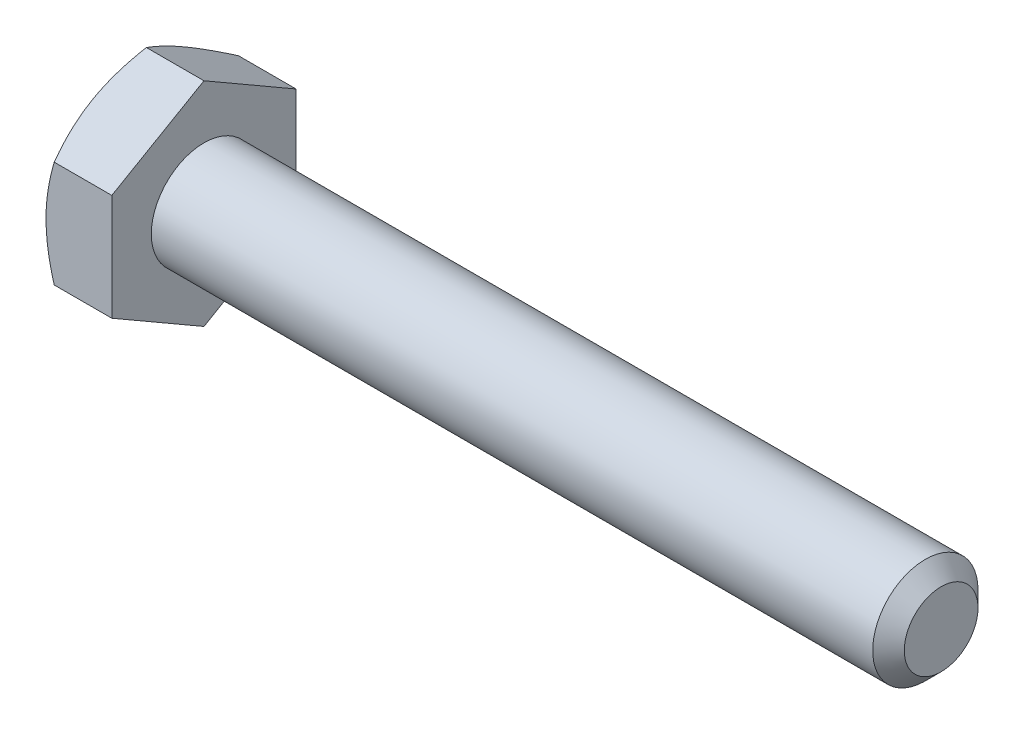
ISO-10303-21;
HEADER;
FILE_DESCRIPTION(('STEP AP214'),'2;1');
FILE_NAME('part.step','',(''),(''),'','','');
FILE_SCHEMA(('AUTOMOTIVE_DESIGN { 1 0 10303 214 1 1 1 1 }'));
ENDSEC;
DATA;
#1=APPLICATION_CONTEXT('core data for automotive mechanical design processes');
#2=APPLICATION_PROTOCOL_DEFINITION('international standard','automotive_design',2000,#1);
#3=PRODUCT_CONTEXT('',#1,'mechanical');
#4=PRODUCT('Part','Part','',(#3));
#5=PRODUCT_RELATED_PRODUCT_CATEGORY('part','',(#4));
#6=PRODUCT_DEFINITION_FORMATION('','',#4);
#7=PRODUCT_DEFINITION_CONTEXT('part definition',#1,'design');
#8=PRODUCT_DEFINITION('design','',#6,#7);
#9=PRODUCT_DEFINITION_SHAPE('','',#8);
#10=(LENGTH_UNIT() NAMED_UNIT(*) SI_UNIT(.MILLI.,.METRE.));
#11=(NAMED_UNIT(*) PLANE_ANGLE_UNIT() SI_UNIT($,.RADIAN.));
#12=(NAMED_UNIT(*) SI_UNIT($,.STERADIAN.) SOLID_ANGLE_UNIT());
#13=UNCERTAINTY_MEASURE_WITH_UNIT(LENGTH_MEASURE(1.E-05),#10,'distance_accuracy_value','');
#14=(GEOMETRIC_REPRESENTATION_CONTEXT(3) GLOBAL_UNCERTAINTY_ASSIGNED_CONTEXT((#13)) GLOBAL_UNIT_ASSIGNED_CONTEXT((#10,
#11,#12)) REPRESENTATION_CONTEXT('',''));
#15=CARTESIAN_POINT('',(0.,0.,0.));
#16=DIRECTION('',(0.,0.,1.));
#17=DIRECTION('',(1.,0.,0.));
#18=AXIS2_PLACEMENT_3D('',#15,#16,#17);
#19=CARTESIAN_POINT('',(-24.209375,-3.20790243318486,5.55625));
#20=DIRECTION('',(0.,0.,-1.));
#21=DIRECTION('',(0.,1.,0.));
#22=AXIS2_PLACEMENT_3D('',#19,#20,#21);
#23=PLANE('',#22);
#24=CARTESIAN_POINT('',(-21.4495843669925,-8.71597197874928,5.55625));
#25=CARTESIAN_POINT('',(-21.5681276134455,-8.47241296686081,5.55625));
#26=CARTESIAN_POINT('',(-21.6855624325106,-8.22830532002065,5.55625));
#27=CARTESIAN_POINT('',(-21.9175936359799,-7.73870131011008,5.55625));
#28=CARTESIAN_POINT('',(-22.0321895915108,-7.49320474401133,5.55625));
#29=CARTESIAN_POINT('',(-22.2584767997047,-6.99931388746861,5.55625));
#30=CARTESIAN_POINT('',(-22.3701496861504,-6.75091115377122,5.55625));
#31=CARTESIAN_POINT('',(-22.5890550680343,-6.25216399271396,5.55625));
#32=CARTESIAN_POINT('',(-22.6962877669676,-6.00181965496413,5.55625));
#33=CARTESIAN_POINT('',(-22.9086259632592,-5.49040404685734,5.55625));
#34=CARTESIAN_POINT('',(-23.0135413372932,-5.22925341692313,5.55625));
#35=CARTESIAN_POINT('',(-23.2156690406665,-4.70393363694384,5.55625));
#36=CARTESIAN_POINT('',(-23.3128805198239,-4.43976415741687,5.55625));
#37=CARTESIAN_POINT('',(-23.497121601985,-3.90845027150971,5.55625));
#38=CARTESIAN_POINT('',(-23.5841709710349,-3.64131278581567,5.55625));
#39=CARTESIAN_POINT('',(-23.7453596469694,-3.10320429735546,5.55625));
#40=CARTESIAN_POINT('',(-23.8195029151649,-2.83223449856134,5.55625));
#41=CARTESIAN_POINT('',(-23.9509992911479,-2.28781102521185,5.55625));
#42=CARTESIAN_POINT('',(-24.0084450300266,-2.01438008102813,5.55625));
#43=CARTESIAN_POINT('',(-24.1033467478451,-1.46397793148425,5.55625));
#44=CARTESIAN_POINT('',(-24.1408048504601,-1.18700710543778,5.55625));
#45=CARTESIAN_POINT('',(-24.179519215684,-0.77183967915967,5.55625));
#46=CARTESIAN_POINT('',(-24.189501938354,-0.634423748801413,5.55625));
#47=CARTESIAN_POINT('',(-24.2036468286742,-0.359297220791254,5.55625));
#48=CARTESIAN_POINT('',(-24.2078095453193,-0.221586652159766,5.55625));
#49=CARTESIAN_POINT('',(-24.2102100203321,0.0538978121001032,5.55625));
#50=CARTESIAN_POINT('',(-24.2084472582896,0.191671712228108,5.55625));
#51=CARTESIAN_POINT('',(-24.1990420123307,0.467008988572043,5.55625));
#52=CARTESIAN_POINT('',(-24.1913997515358,0.604572372578371,5.55625));
#53=CARTESIAN_POINT('',(-24.1663631708715,0.932168886546727,5.55625));
#54=CARTESIAN_POINT('',(-24.146346615147,1.12200607500774,5.55625));
#55=CARTESIAN_POINT('',(-24.0961855559147,1.50032750566802,5.55625));
#56=CARTESIAN_POINT('',(-24.0660397617237,1.68881157232281,5.55625));
#57=CARTESIAN_POINT('',(-23.9620024146897,2.25198169738515,5.55625));
#58=CARTESIAN_POINT('',(-23.8745274707725,2.6241947560597,5.55625));
#59=CARTESIAN_POINT('',(-23.7220938857469,3.18100797717286,5.55625));
#60=CARTESIAN_POINT('',(-23.666996347305,3.3684742193473,5.55625));
#61=CARTESIAN_POINT('',(-23.5508963006724,3.74158722888387,5.55625));
#62=CARTESIAN_POINT('',(-23.4898937479768,3.92723398252124,5.55625));
#63=CARTESIAN_POINT('',(-23.3629776325897,4.29676489564761,5.55625));
#64=CARTESIAN_POINT('',(-23.2970655075926,4.4806495534762,5.55625));
#65=CARTESIAN_POINT('',(-23.1611240596993,4.84688123577246,5.55625));
#66=CARTESIAN_POINT('',(-23.0910948245767,5.02922829292587,5.55625));
#67=CARTESIAN_POINT('',(-22.9001931773471,5.51260356628247,5.55625));
#68=CARTESIAN_POINT('',(-22.7763007551523,5.8124378410047,5.55625));
#69=CARTESIAN_POINT('',(-22.5214246065505,6.40908803513469,5.55625));
#70=CARTESIAN_POINT('',(-22.3904401468771,6.70590363865018,5.55625));
#71=CARTESIAN_POINT('',(-22.1230293545831,7.29719434259167,5.55625));
#72=CARTESIAN_POINT('',(-21.9866010743512,7.59166855933578,5.55624999999999));
#73=CARTESIAN_POINT('',(-21.7095811116465,8.17863206091545,5.55624999999999));
#74=CARTESIAN_POINT('',(-21.5689895864128,8.47112142020427,5.55624999999999));
#75=CARTESIAN_POINT('',(-21.284318147738,9.05495036819324,5.55624999999999));
#76=CARTESIAN_POINT('',(-21.1402332095448,9.34628750192602,5.55624999999999));
#77=CARTESIAN_POINT('',(-20.8494465475127,9.9276532853253,5.55624999999999));
#78=CARTESIAN_POINT('',(-20.7027448035253,10.2176819248953,5.55624999999999));
#79=CARTESIAN_POINT('',(-20.2595640177122,11.0860438246278,5.55624999999999));
#80=CARTESIAN_POINT('',(-19.9599489566421,11.6627758925917,5.55624999999999));
#81=CARTESIAN_POINT('',(-19.3862850053505,12.7539662387514,5.55624999999999));
#82=CARTESIAN_POINT('',(-19.1127850436465,13.2687144928819,5.55624999999999));
#83=CARTESIAN_POINT('',(-18.5624510158717,14.2964629870514,5.55624999999999));
#84=CARTESIAN_POINT('',(-18.2856167576174,14.8094631241242,5.55624999999999));
#85=CARTESIAN_POINT('',(-17.7303732577565,15.8324606524662,5.55624999999999));
#86=CARTESIAN_POINT('',(-17.4519720091832,16.3424623888781,5.55624999999999));
#87=CARTESIAN_POINT('',(-16.8932670469657,17.3613731639511,5.55624999999999));
#88=CARTESIAN_POINT('',(-16.6129634782856,17.8702822820683,5.55624999999999));
#89=CARTESIAN_POINT('',(-16.3319657879674,18.3788054223414,5.55624999999999));
#90=B_SPLINE_CURVE_WITH_KNOTS('',3,(#24,#25,#26,#27,#28,#29,#30,#31,#32,#33,#34,#35,#36,#37,#38,
#39,#40,#41,#42,#43,#44,#45,#46,#47,#48,#49,#50,#51,#52,#53,#54,#55,#56,#57,#58,#59,#60,#61,#62,
#63,#64,#65,#66,#67,#68,#69,#70,#71,#72,#73,#74,#75,#76,#77,#78,#79,#80,#81,#82,#83,#84,#85,#86,
#87,#88,#89),.UNSPECIFIED.,.F.,.F.,(4,2,2,2,2,2,2,2,2,2,2,2,2,2,2,2,2,2,2,2,2,2,2,2,2,2,2,2,2,2,
2,2,4),(0.,0.812635730373023,1.62539348788032,2.44240990684273,3.25938884015621,
4.10360649542401,4.94791718701091,5.79055726038603,6.63293824174536,7.47055271943839,
8.30807818332957,8.72130785168299,9.13449853788832,9.54772551385981,9.96093680902995,
10.5332843829937,11.1057049140379,12.2511183074305,12.8372525638741,13.4233912382427,
14.0093589404389,14.5953141547965,15.5684465267885,16.5416797066259,17.5152642537239,
18.4888120769129,19.4638547232904,20.4389048803864,22.3885945301673,24.1372706665326,
25.886048080782,27.6291677691576,29.3721560841402),.UNSPECIFIED.);
#91=CARTESIAN_POINT('',(-23.7131107665182,-3.20790243318486,5.55625));
#92=VERTEX_POINT('',#91);
#93=CARTESIAN_POINT('',(-24.209375,0.,5.55625));
#94=VERTEX_POINT('',#93);
#95=EDGE_CURVE('E280',#92,#94,#90,.T.);
#96=ORIENTED_EDGE('',*,*,#95,.F.);
#97=DIRECTION('',(1.,0.,0.));
#98=VECTOR('',#97,1.);
#99=CARTESIAN_POINT('',(-24.209375,-3.20790243318486,5.55625));
#100=LINE('',#99,#98);
#101=CARTESIAN_POINT('',(-20.240625,-3.20790243318486,5.55625));
#102=VERTEX_POINT('',#101);
#103=EDGE_CURVE('E283',#92,#102,#100,.T.);
#104=ORIENTED_EDGE('',*,*,#103,.T.);
#105=DIRECTION('',(0.,1.,0.));
#106=VECTOR('',#105,1.);
#107=CARTESIAN_POINT('',(-20.240625,-3.20790243318486,5.55625));
#108=LINE('',#107,#106);
#109=CARTESIAN_POINT('',(-20.240625,3.20790243318486,5.55625));
#110=VERTEX_POINT('',#109);
#111=EDGE_CURVE('E286',#102,#110,#108,.T.);
#112=ORIENTED_EDGE('',*,*,#111,.T.);
#113=DIRECTION('',(1.,0.,0.));
#114=VECTOR('',#113,1.);
#115=CARTESIAN_POINT('',(-24.209375,3.20790243318486,5.55625));
#116=LINE('',#115,#114);
#117=CARTESIAN_POINT('',(-23.7131107665182,3.20790243318486,5.55625));
#118=VERTEX_POINT('',#117);
#119=EDGE_CURVE('E242',#118,#110,#116,.T.);
#120=ORIENTED_EDGE('',*,*,#119,.F.);
#121=EDGE_CURVE('E119',#94,#118,#90,.T.);
#122=ORIENTED_EDGE('',*,*,#121,.F.);
#123=EDGE_LOOP('',(#96,#104,#112,#120,#122));
#124=FACE_BOUND('',#123,.T.);
#125=ADVANCED_FACE('F42',(#124),#23,.F.);
#126=CARTESIAN_POINT('',(-24.209375,3.20790243318486,5.55625));
#127=DIRECTION('',(0.,-0.866025403784438,-0.5));
#128=DIRECTION('',(0.,0.5,-0.866025403784439));
#129=AXIS2_PLACEMENT_3D('',#126,#127,#128);
#130=PLANE('',#129);
#131=CARTESIAN_POINT('',(-23.7130440980518,3.20778696313102,5.55645));
#132=CARTESIAN_POINT('',(-23.7537494396287,3.27830048099898,5.43431700443227));
#133=CARTESIAN_POINT('',(-23.7926074606368,3.34907690760433,5.31172863757364));
#134=CARTESIAN_POINT('',(-23.8661200665754,3.49120454378004,5.06555635055764));
#135=CARTESIAN_POINT('',(-23.9007728381981,3.56255598725623,4.94197202526351));
#136=CARTESIAN_POINT('',(-23.9977431144389,3.7777527611819,4.56924027919934));
#137=CARTESIAN_POINT('',(-24.052898945498,3.92244755263586,4.3186215488105));
#138=CARTESIAN_POINT('',(-24.117576095153,4.13898067940738,3.94357517172046));
#139=CARTESIAN_POINT('',(-24.1360008296374,4.21017202280888,3.82026814788997));
#140=CARTESIAN_POINT('',(-24.1668966337596,4.35287639627881,3.57309692257778));
#141=CARTESIAN_POINT('',(-24.179368229438,4.42438939736052,3.44923277130254));
#142=CARTESIAN_POINT('',(-24.1980399134017,4.56753961185542,3.20128932668298));
#143=CARTESIAN_POINT('',(-24.2042471193166,4.63917659144933,3.07721043832556));
#144=CARTESIAN_POINT('',(-24.2102635825862,4.7825127822332,2.82894487332451));
#145=CARTESIAN_POINT('',(-24.2100730375727,4.85421199143242,2.70475820012895));
#146=CARTESIAN_POINT('',(-24.2007567573071,5.05064720059277,2.36452243746779));
#147=CARTESIAN_POINT('',(-24.1851153403106,5.1753189069971,2.14858470770919));
#148=CARTESIAN_POINT('',(-24.1355150950254,5.42383425573453,1.71814349723526));
#149=CARTESIAN_POINT('',(-24.1015393117333,5.54767702400135,1.50364153044716));
#150=CARTESIAN_POINT('',(-24.0166092499519,5.79669255822861,1.07233397329164));
#151=CARTESIAN_POINT('',(-23.9652951119579,5.92183390122649,0.855582809091896));
#152=CARTESIAN_POINT('',(-23.8488325447076,6.17025031750736,0.425312954659246));
#153=CARTESIAN_POINT('',(-23.7837114741206,6.29352857247572,0.211788753585619));
#154=CARTESIAN_POINT('',(-23.7130440980518,6.41592033642355,-0.000200000000001761));
#155=B_SPLINE_CURVE_WITH_KNOTS('',3,(#131,#132,#133,#134,#135,#136,#137,#138,#139,#140,#141,
#142,#143,#144,#145,#146,#147,#148,#149,#150,#151,#152,#153,#154),.UNSPECIFIED.,.F.,.F.,(4,2,2,
2,2,2,2,2,2,2,2,4),(0.,0.440316908268041,0.880823012040823,1.76366572331169,2.19427472390783,
2.62484566732156,3.05492684132792,3.48499472977669,4.23370964386674,4.98311813377593,
5.74914806559356,6.51367405016872),.UNSPECIFIED.);
#156=CARTESIAN_POINT('',(-24.209375,4.81185364977729,2.778125));
#157=VERTEX_POINT('',#156);
#158=EDGE_CURVE('E115',#118,#157,#155,.T.);
#159=ORIENTED_EDGE('',*,*,#158,.F.);
#160=ORIENTED_EDGE('',*,*,#119,.T.);
#161=DIRECTION('',(0.,0.5,-0.866025403784438));
#162=VECTOR('',#161,1.);
#163=CARTESIAN_POINT('',(-20.240625,3.20790243318486,5.55625));
#164=LINE('',#163,#162);
#165=CARTESIAN_POINT('',(-20.240625,6.41580486636972,0.));
#166=VERTEX_POINT('',#165);
#167=EDGE_CURVE('E310',#110,#166,#164,.T.);
#168=ORIENTED_EDGE('',*,*,#167,.T.);
#169=DIRECTION('',(1.,0.,0.));
#170=VECTOR('',#169,1.);
#171=CARTESIAN_POINT('',(-24.209375,6.41580486636972,0.));
#172=LINE('',#171,#170);
#173=CARTESIAN_POINT('',(-23.7131107665182,6.41580486636972,0.));
#174=VERTEX_POINT('',#173);
#175=EDGE_CURVE('E140',#174,#166,#172,.T.);
#176=ORIENTED_EDGE('',*,*,#175,.F.);
#177=EDGE_CURVE('E124',#157,#174,#155,.T.);
#178=ORIENTED_EDGE('',*,*,#177,.F.);
#179=EDGE_LOOP('',(#159,#160,#168,#176,#178));
#180=FACE_BOUND('',#179,.T.);
#181=ADVANCED_FACE('F138',(#180),#130,.F.);
#182=CARTESIAN_POINT('',(-24.209375,6.41580486636972,0.));
#183=DIRECTION('',(0.,-0.866025403784439,0.5));
#184=DIRECTION('',(0.,-0.5,-0.866025403784439));
#185=AXIS2_PLACEMENT_3D('',#182,#183,#184);
#186=PLANE('',#185);
#187=CARTESIAN_POINT('',(-23.7130440980518,6.41592033642355,0.000199999999998725));
#188=CARTESIAN_POINT('',(-23.7537494396287,6.34540681855559,-0.121932995567732));
#189=CARTESIAN_POINT('',(-23.7926074606368,6.27463039195025,-0.244521362426355));
#190=CARTESIAN_POINT('',(-23.8661200665754,6.13250275577453,-0.490693649442358));
#191=CARTESIAN_POINT('',(-23.9007728381981,6.06115131229835,-0.61427797473649));
#192=CARTESIAN_POINT('',(-23.9977431144389,5.84595453837268,-0.987009720800664));
#193=CARTESIAN_POINT('',(-24.052898945498,5.70125974691872,-1.2376284511895));
#194=CARTESIAN_POINT('',(-24.117576095153,5.48472662014719,-1.61267482827954));
#195=CARTESIAN_POINT('',(-24.1360008296374,5.41353527674569,-1.73598185211002));
#196=CARTESIAN_POINT('',(-24.1668966337596,5.27083090327577,-1.98315307742222));
#197=CARTESIAN_POINT('',(-24.179368229438,5.19931790219406,-2.10701722869746));
#198=CARTESIAN_POINT('',(-24.1980399134017,5.05616768769916,-2.35496067331702));
#199=CARTESIAN_POINT('',(-24.2042471193166,4.98453070810525,-2.47903956167444));
#200=CARTESIAN_POINT('',(-24.2102635825862,4.84119451732138,-2.72730512667549));
#201=CARTESIAN_POINT('',(-24.2100730375727,4.76949530812216,-2.85149179987105));
#202=CARTESIAN_POINT('',(-24.2007567573071,4.5730600989618,-3.19172756253221));
#203=CARTESIAN_POINT('',(-24.1851153403106,4.44838839255747,-3.40766529229081));
#204=CARTESIAN_POINT('',(-24.1355150950254,4.19987304382004,-3.83810650276474));
#205=CARTESIAN_POINT('',(-24.1015393117333,4.07603027555323,-4.05260846955284));
#206=CARTESIAN_POINT('',(-24.0166092499519,3.82701474132597,-4.48391602670836));
#207=CARTESIAN_POINT('',(-23.9652951119579,3.70187339832808,-4.7006671909081));
#208=CARTESIAN_POINT('',(-23.8488325447076,3.45345698204721,-5.13093704534075));
#209=CARTESIAN_POINT('',(-23.7837114741206,3.33017872707885,-5.34446124641438));
#210=CARTESIAN_POINT('',(-23.7130440980518,3.20778696313102,-5.55645));
#211=B_SPLINE_CURVE_WITH_KNOTS('',3,(#187,#188,#189,#190,#191,#192,#193,#194,#195,#196,#197,
#198,#199,#200,#201,#202,#203,#204,#205,#206,#207,#208,#209,#210),.UNSPECIFIED.,.F.,.F.,(4,2,2,
2,2,2,2,2,2,2,2,4),(0.,0.440316908268042,0.880823012040824,1.76366572331169,2.19427472390783,
2.62484566732156,3.05492684132792,3.48499472977669,4.23370964386674,4.98311813377593,
5.74914806559356,6.51367405016872),.UNSPECIFIED.);
#212=CARTESIAN_POINT('',(-24.209375,4.81185364977729,-2.778125));
#213=VERTEX_POINT('',#212);
#214=EDGE_CURVE('E129',#174,#213,#211,.T.);
#215=ORIENTED_EDGE('',*,*,#214,.F.);
#216=ORIENTED_EDGE('',*,*,#175,.T.);
#217=DIRECTION('',(0.,-0.5,-0.866025403784439));
#218=VECTOR('',#217,1.);
#219=CARTESIAN_POINT('',(-20.240625,6.41580486636972,0.));
#220=LINE('',#219,#218);
#221=CARTESIAN_POINT('',(-20.240625,3.20790243318486,-5.55625));
#222=VERTEX_POINT('',#221);
#223=EDGE_CURVE('E307',#166,#222,#220,.T.);
#224=ORIENTED_EDGE('',*,*,#223,.T.);
#225=DIRECTION('',(1.,0.,0.));
#226=VECTOR('',#225,1.);
#227=CARTESIAN_POINT('',(-24.209375,3.20790243318486,-5.55625));
#228=LINE('',#227,#226);
#229=CARTESIAN_POINT('',(-23.7131107665182,3.20790243318486,-5.55625));
#230=VERTEX_POINT('',#229);
#231=EDGE_CURVE('E302',#230,#222,#228,.T.);
#232=ORIENTED_EDGE('',*,*,#231,.F.);
#233=EDGE_CURVE('E143',#213,#230,#211,.T.);
#234=ORIENTED_EDGE('',*,*,#233,.F.);
#235=EDGE_LOOP('',(#215,#216,#224,#232,#234));
#236=FACE_BOUND('',#235,.T.);
#237=ADVANCED_FACE('F204',(#236),#186,.F.);
#238=CARTESIAN_POINT('',(-24.209375,3.20790243318486,-5.55625));
#239=DIRECTION('',(0.,0.,1.));
#240=DIRECTION('',(0.,-1.,0.));
#241=AXIS2_PLACEMENT_3D('',#238,#239,#240);
#242=PLANE('',#241);
#243=CARTESIAN_POINT('',(-21.449584368384,-8.71597197589097,-5.55625));
#244=CARTESIAN_POINT('',(-21.568127614779,-8.4724129640987,-5.55625));
#245=CARTESIAN_POINT('',(-21.685562433786,-8.22830531735482,-5.55625));
#246=CARTESIAN_POINT('',(-21.9175936371396,-7.73870130763708,-5.55625));
#247=CARTESIAN_POINT('',(-22.0321895926128,-7.4932047416349,-5.55625));
#248=CARTESIAN_POINT('',(-22.2584768006911,-6.99931388528678,-5.55625));
#249=CARTESIAN_POINT('',(-22.3701496870791,-6.75091115168743,-5.55625));
#250=CARTESIAN_POINT('',(-22.5890550688484,-6.25216399082691,-5.55625));
#251=CARTESIAN_POINT('',(-22.6962877677249,-6.00181965317578,-5.55625));
#252=CARTESIAN_POINT('',(-22.9086259639013,-5.49040404527406,-5.55625));
#253=CARTESIAN_POINT('',(-23.013541337877,-5.22925341544629,-5.55625));
#254=CARTESIAN_POINT('',(-23.2156690411367,-4.70393363568156,-5.55625));
#255=CARTESIAN_POINT('',(-23.3128805202389,-4.43976415626273,-5.55625));
#256=CARTESIAN_POINT('',(-23.4971216022948,-3.90845027057386,-5.55625));
#257=CARTESIAN_POINT('',(-23.5841709712948,-3.64131278498994,-5.55625));
#258=CARTESIAN_POINT('',(-23.7453596471374,-3.10320429675299,-5.55625));
#259=CARTESIAN_POINT('',(-23.819502915291,-2.83223449807201,-5.55625));
#260=CARTESIAN_POINT('',(-23.9509992911896,-2.28781102500664,-5.55625));
#261=CARTESIAN_POINT('',(-24.0084450300289,-2.01438008099472,-5.55625));
#262=CARTESIAN_POINT('',(-24.1033467477944,-1.46397793179866,-5.55625));
#263=CARTESIAN_POINT('',(-24.1408048503959,-1.18700710592821,-5.55625));
#264=CARTESIAN_POINT('',(-24.1795192156229,-0.771839679912929,-5.55625));
#265=CARTESIAN_POINT('',(-24.1895019382978,-0.634423749641011,-5.55625));
#266=CARTESIAN_POINT('',(-24.2036468286352,-0.359297221803361,-5.55625));
#267=CARTESIAN_POINT('',(-24.2078095452928,-0.221586653258043,-5.55625));
#268=CARTESIAN_POINT('',(-24.2102100203379,0.0538978108301058,-5.55625));
#269=CARTESIAN_POINT('',(-24.2084472583154,0.191671710872559,-5.55625));
#270=CARTESIAN_POINT('',(-24.1990420124033,0.467008987046523,-5.55625));
#271=CARTESIAN_POINT('',(-24.1913997516352,0.604572370968431,-5.55625));
#272=CARTESIAN_POINT('',(-24.1663631710371,0.932168884806747,-5.55625));
#273=CARTESIAN_POINT('',(-24.1463466153506,1.12200607322251,-5.55625));
#274=CARTESIAN_POINT('',(-24.0961855561963,1.50032750379435,-5.55625));
#275=CARTESIAN_POINT('',(-24.0660397620454,1.68881157040595,-5.55625));
#276=CARTESIAN_POINT('',(-23.9620024151322,2.25198169534108,-5.55625));
#277=CARTESIAN_POINT('',(-23.8745274712967,2.62419475393417,-5.55625));
#278=CARTESIAN_POINT('',(-23.7220938863917,3.18100797492548,-5.55625));
#279=CARTESIAN_POINT('',(-23.6669963479902,3.36847421705843,-5.55625));
#280=CARTESIAN_POINT('',(-23.5508963014373,3.74158722651249,-5.55625));
#281=CARTESIAN_POINT('',(-23.4898937487809,3.92723398010884,-5.55625));
#282=CARTESIAN_POINT('',(-23.3629776334707,4.29676489315347,-5.55625));
#283=CARTESIAN_POINT('',(-23.2970655085115,4.48064955094134,-5.55625));
#284=CARTESIAN_POINT('',(-23.1611240606925,4.84688123315617,-5.55625));
#285=CARTESIAN_POINT('',(-23.0910948256063,5.02922829026885,-5.55625));
#286=CARTESIAN_POINT('',(-22.9001931784386,5.51260356360176,-5.55625));
#287=CARTESIAN_POINT('',(-22.7763007562656,5.81243783833987,-5.55625));
#288=CARTESIAN_POINT('',(-22.5214246077012,6.4090880324996,-5.55625));
#289=CARTESIAN_POINT('',(-22.3904401480433,6.70590363602894,-5.55625));
#290=CARTESIAN_POINT('',(-22.1230293557759,7.29719433999666,-5.55625));
#291=CARTESIAN_POINT('',(-21.9866010755551,7.59166855675315,-5.55625));
#292=CARTESIAN_POINT('',(-21.7095811128693,8.17863205835625,-5.55625));
#293=CARTESIAN_POINT('',(-21.5689895876434,8.47112141765612,-5.55625));
#294=CARTESIAN_POINT('',(-21.2843181489817,9.05495036566683,-5.55625));
#295=CARTESIAN_POINT('',(-21.1402332107937,9.34628749941031,-5.55625));
#296=CARTESIAN_POINT('',(-20.8494465487701,9.92765328283016,-5.55625));
#297=CARTESIAN_POINT('',(-20.7027448047861,10.2176819224101,-5.55625));
#298=CARTESIAN_POINT('',(-20.2595640189813,11.086043822171,-5.55625));
#299=CARTESIAN_POINT('',(-19.9599489579141,11.6627758901527,-5.55625));
#300=CARTESIAN_POINT('',(-19.3862850066326,12.75396623633,-5.55625));
#301=CARTESIAN_POINT('',(-19.1127850449362,13.2687144904607,-5.55625));
#302=CARTESIAN_POINT('',(-18.5624510171751,14.2964629846299,-5.55625));
#303=CARTESIAN_POINT('',(-18.2856167589269,14.8094631217022,-5.55625));
#304=CARTESIAN_POINT('',(-17.7303732590784,15.8324606500401,-5.55625));
#305=CARTESIAN_POINT('',(-17.4519720105114,16.3424623864486,-5.55625));
#306=CARTESIAN_POINT('',(-16.8932670483059,17.3613731615141,-5.55625));
#307=CARTESIAN_POINT('',(-16.6129634796314,17.8702822796274,-5.55625));
#308=CARTESIAN_POINT('',(-16.3319657893186,18.3788054198964,-5.55625));
#309=B_SPLINE_CURVE_WITH_KNOTS('',3,(#243,#244,#245,#246,#247,#248,#249,#250,#251,#252,#253,
#254,#255,#256,#257,#258,#259,#260,#261,#262,#263,#264,#265,#266,#267,#268,#269,#270,#271,#272,
#273,#274,#275,#276,#277,#278,#279,#280,#281,#282,#283,#284,#285,#286,#287,#288,#289,#290,#291,
#292,#293,#294,#295,#296,#297,#298,#299,#300,#301,#302,#303,#304,#305,#306,#307,#308),
.UNSPECIFIED.,.F.,.F.,(4,2,2,2,2,2,2,2,2,2,2,2,2,2,2,2,2,2,2,2,2,2,2,2,2,2,2,2,2,2,2,2,4),(0.,
0.812635730037296,1.62539348720883,2.44240990583192,3.25938883880611,4.10360649371243,
4.94791718493774,5.79055725795246,6.63293823895167,7.4705527161171,8.30807817948146,
8.7213078475778,9.13449853352613,9.54772550924045,9.96093680415345,10.5332843779703,
11.1057049088676,12.2511183019659,12.8372525582557,13.4233912324707,14.0093589345136,
14.5953141487179,15.5684465207287,16.5416797005853,17.5152642477029,18.4888120709116,
19.4638547173109,20.4389048744288,22.3885945242527,24.1372706606078,25.8860480748471,
27.6291677632044,29.3721560781684),.UNSPECIFIED.);
#310=CARTESIAN_POINT('',(-24.209375,0.,-5.55625));
#311=VERTEX_POINT('',#310);
#312=EDGE_CURVE('E198',#230,#311,#309,.F.);
#313=ORIENTED_EDGE('',*,*,#312,.F.);
#314=ORIENTED_EDGE('',*,*,#231,.T.);
#315=DIRECTION('',(0.,-1.,0.));
#316=VECTOR('',#315,1.);
#317=CARTESIAN_POINT('',(-20.240625,3.20790243318486,-5.55625));
#318=LINE('',#317,#316);
#319=CARTESIAN_POINT('',(-20.240625,-3.20790243318486,-5.55625));
#320=VERTEX_POINT('',#319);
#321=EDGE_CURVE('E315',#222,#320,#318,.T.);
#322=ORIENTED_EDGE('',*,*,#321,.T.);
#323=DIRECTION('',(1.,0.,0.));
#324=VECTOR('',#323,1.);
#325=CARTESIAN_POINT('',(-24.209375,-3.20790243318486,-5.55625));
#326=LINE('',#325,#324);
#327=CARTESIAN_POINT('',(-23.7131107665182,-3.20790243318486,-5.55625));
#328=VERTEX_POINT('',#327);
#329=EDGE_CURVE('E264',#328,#320,#326,.T.);
#330=ORIENTED_EDGE('',*,*,#329,.F.);
#331=EDGE_CURVE('E191',#311,#328,#309,.F.);
#332=ORIENTED_EDGE('',*,*,#331,.F.);
#333=EDGE_LOOP('',(#313,#314,#322,#330,#332));
#334=FACE_BOUND('',#333,.T.);
#335=ADVANCED_FACE('F200',(#334),#242,.F.);
#336=CARTESIAN_POINT('',(-24.209375,-3.20790243318486,-5.55625));
#337=DIRECTION('',(0.,0.866025403784439,0.5));
#338=DIRECTION('',(0.,-0.5,0.866025403784439));
#339=AXIS2_PLACEMENT_3D('',#336,#337,#338);
#340=PLANE('',#339);
#341=CARTESIAN_POINT('',(-23.7130440980518,-3.20778696313102,-5.55645));
#342=CARTESIAN_POINT('',(-23.7537494396287,-3.27830048099898,-5.43431700443227));
#343=CARTESIAN_POINT('',(-23.7926074606368,-3.34907690760433,-5.31172863757365));
#344=CARTESIAN_POINT('',(-23.8661200665754,-3.49120454378004,-5.06555635055764));
#345=CARTESIAN_POINT('',(-23.9007728381981,-3.56255598725623,-4.94197202526351));
#346=CARTESIAN_POINT('',(-23.9977431144389,-3.7777527611819,-4.56924027919934));
#347=CARTESIAN_POINT('',(-24.052898945498,-3.92244755263586,-4.3186215488105));
#348=CARTESIAN_POINT('',(-24.117576095153,-4.13898067940738,-3.94357517172046));
#349=CARTESIAN_POINT('',(-24.1360008296374,-4.21017202280888,-3.82026814788997));
#350=CARTESIAN_POINT('',(-24.1668966337596,-4.35287639627881,-3.57309692257778));
#351=CARTESIAN_POINT('',(-24.179368229438,-4.42438939736051,-3.44923277130254));
#352=CARTESIAN_POINT('',(-24.1980399134017,-4.56753961185542,-3.20128932668298));
#353=CARTESIAN_POINT('',(-24.2042471193166,-4.63917659144933,-3.07721043832556));
#354=CARTESIAN_POINT('',(-24.2102635825862,-4.7825127822332,-2.82894487332451));
#355=CARTESIAN_POINT('',(-24.2100730375727,-4.85421199143242,-2.70475820012895));
#356=CARTESIAN_POINT('',(-24.2007567573071,-5.05064720059277,-2.36452243746779));
#357=CARTESIAN_POINT('',(-24.1851153403106,-5.1753189069971,-2.14858470770919));
#358=CARTESIAN_POINT('',(-24.1355150950254,-5.42383425573453,-1.71814349723526));
#359=CARTESIAN_POINT('',(-24.1015393117333,-5.54767702400135,-1.50364153044716));
#360=CARTESIAN_POINT('',(-24.0166092499519,-5.7966925582286,-1.07233397329164));
#361=CARTESIAN_POINT('',(-23.9652951119579,-5.92183390122649,-0.855582809091897));
#362=CARTESIAN_POINT('',(-23.8488325447076,-6.17025031750736,-0.425312954659246));
#363=CARTESIAN_POINT('',(-23.7837114741206,-6.29352857247572,-0.21178875358562));
#364=CARTESIAN_POINT('',(-23.7130440980518,-6.41592033642355,0.000200000000000885));
#365=B_SPLINE_CURVE_WITH_KNOTS('',3,(#341,#342,#343,#344,#345,#346,#347,#348,#349,#350,#351,
#352,#353,#354,#355,#356,#357,#358,#359,#360,#361,#362,#363,#364),.UNSPECIFIED.,.F.,.F.,(4,2,2,
2,2,2,2,2,2,2,2,4),(0.,0.440316908268041,0.880823012040824,1.76366572331169,2.19427472390783,
2.62484566732156,3.05492684132792,3.48499472977669,4.23370964386674,4.98311813377593,
5.74914806559356,6.51367405016872),.UNSPECIFIED.);
#366=CARTESIAN_POINT('',(-24.209375,-4.81185364977729,-2.778125));
#367=VERTEX_POINT('',#366);
#368=EDGE_CURVE('E199',#328,#367,#365,.T.);
#369=ORIENTED_EDGE('',*,*,#368,.F.);
#370=ORIENTED_EDGE('',*,*,#329,.T.);
#371=DIRECTION('',(0.,-0.5,0.866025403784439));
#372=VECTOR('',#371,1.);
#373=CARTESIAN_POINT('',(-20.240625,-3.20790243318486,-5.55625));
#374=LINE('',#373,#372);
#375=CARTESIAN_POINT('',(-20.240625,-6.41580486636971,0.));
#376=VERTEX_POINT('',#375);
#377=EDGE_CURVE('E296',#320,#376,#374,.T.);
#378=ORIENTED_EDGE('',*,*,#377,.T.);
#379=DIRECTION('',(1.,0.,0.));
#380=VECTOR('',#379,1.);
#381=CARTESIAN_POINT('',(-24.209375,-6.41580486636971,0.));
#382=LINE('',#381,#380);
#383=CARTESIAN_POINT('',(-23.7131107665182,-6.41580486636971,0.));
#384=VERTEX_POINT('',#383);
#385=EDGE_CURVE('E291',#384,#376,#382,.T.);
#386=ORIENTED_EDGE('',*,*,#385,.F.);
#387=EDGE_CURVE('E185',#367,#384,#365,.T.);
#388=ORIENTED_EDGE('',*,*,#387,.F.);
#389=EDGE_LOOP('',(#369,#370,#378,#386,#388));
#390=FACE_BOUND('',#389,.T.);
#391=ADVANCED_FACE('F203',(#390),#340,.F.);
#392=CARTESIAN_POINT('',(-24.209375,-6.41580486636971,0.));
#393=DIRECTION('',(0.,0.866025403784439,-0.5));
#394=DIRECTION('',(0.,0.5,0.866025403784439));
#395=AXIS2_PLACEMENT_3D('',#392,#393,#394);
#396=PLANE('',#395);
#397=CARTESIAN_POINT('',(-23.7130440980518,-6.41592033642355,-0.000199999999998803));
#398=CARTESIAN_POINT('',(-23.7537494396287,-6.34540681855559,0.121932995567732));
#399=CARTESIAN_POINT('',(-23.7926074606368,-6.27463039195025,0.244521362426354));
#400=CARTESIAN_POINT('',(-23.8661200665754,-6.13250275577453,0.490693649442357));
#401=CARTESIAN_POINT('',(-23.9007728381981,-6.06115131229835,0.614277974736488));
#402=CARTESIAN_POINT('',(-23.9977431144389,-5.84595453837268,0.987009720800663));
#403=CARTESIAN_POINT('',(-24.052898945498,-5.70125974691872,1.2376284511895));
#404=CARTESIAN_POINT('',(-24.117576095153,-5.48472662014719,1.61267482827954));
#405=CARTESIAN_POINT('',(-24.1360008296374,-5.41353527674569,1.73598185211002));
#406=CARTESIAN_POINT('',(-24.1668966337596,-5.27083090327577,1.98315307742222));
#407=CARTESIAN_POINT('',(-24.179368229438,-5.19931790219406,2.10701722869746));
#408=CARTESIAN_POINT('',(-24.1980399134017,-5.05616768769915,2.35496067331702));
#409=CARTESIAN_POINT('',(-24.2042471193166,-4.98453070810525,2.47903956167444));
#410=CARTESIAN_POINT('',(-24.2102635825862,-4.84119451732138,2.72730512667549));
#411=CARTESIAN_POINT('',(-24.2100730375727,-4.76949530812216,2.85149179987105));
#412=CARTESIAN_POINT('',(-24.2007567573071,-4.5730600989618,3.19172756253221));
#413=CARTESIAN_POINT('',(-24.1851153403106,-4.44838839255747,3.40766529229081));
#414=CARTESIAN_POINT('',(-24.1355150950254,-4.19987304382004,3.83810650276474));
#415=CARTESIAN_POINT('',(-24.1015393117333,-4.07603027555323,4.05260846955284));
#416=CARTESIAN_POINT('',(-24.0166092499519,-3.82701474132597,4.48391602670836));
#417=CARTESIAN_POINT('',(-23.9652951119579,-3.70187339832808,4.7006671909081));
#418=CARTESIAN_POINT('',(-23.8488325447076,-3.45345698204721,5.13093704534075));
#419=CARTESIAN_POINT('',(-23.7837114741206,-3.33017872707885,5.34446124641438));
#420=CARTESIAN_POINT('',(-23.7130440980518,-3.20778696313102,5.55645));
#421=B_SPLINE_CURVE_WITH_KNOTS('',3,(#397,#398,#399,#400,#401,#402,#403,#404,#405,#406,#407,
#408,#409,#410,#411,#412,#413,#414,#415,#416,#417,#418,#419,#420),.UNSPECIFIED.,.F.,.F.,(4,2,2,
2,2,2,2,2,2,2,2,4),(0.,0.440316908268041,0.880823012040822,1.76366572331169,2.19427472390783,
2.62484566732156,3.05492684132792,3.48499472977669,4.23370964386674,4.98311813377593,
5.74914806559356,6.51367405016872),.UNSPECIFIED.);
#422=CARTESIAN_POINT('',(-24.209375,-4.81185364977729,2.778125));
#423=VERTEX_POINT('',#422);
#424=EDGE_CURVE('E273',#384,#423,#421,.T.);
#425=ORIENTED_EDGE('',*,*,#424,.F.);
#426=ORIENTED_EDGE('',*,*,#385,.T.);
#427=DIRECTION('',(0.,0.5,0.866025403784439));
#428=VECTOR('',#427,1.);
#429=CARTESIAN_POINT('',(-20.240625,-6.41580486636971,0.));
#430=LINE('',#429,#428);
#431=EDGE_CURVE('E288',#376,#102,#430,.T.);
#432=ORIENTED_EDGE('',*,*,#431,.T.);
#433=ORIENTED_EDGE('',*,*,#103,.F.);
#434=EDGE_CURVE('E135',#423,#92,#421,.T.);
#435=ORIENTED_EDGE('',*,*,#434,.F.);
#436=EDGE_LOOP('',(#425,#426,#432,#433,#435));
#437=FACE_BOUND('',#436,.T.);
#438=ADVANCED_FACE('F226',(#437),#396,.F.);
#439=CARTESIAN_POINT('',(-20.240625,0.,0.));
#440=DIRECTION('',(1.,0.,0.));
#441=DIRECTION('',(0.,0.,-1.));
#442=AXIS2_PLACEMENT_3D('',#439,#440,#441);
#443=CYLINDRICAL_SURFACE('',#442,3.175);
#444=CARTESIAN_POINT('',(23.256875,0.,0.));
#445=DIRECTION('',(1.,0.,0.));
#446=DIRECTION('',(0.,0.,-1.));
#447=AXIS2_PLACEMENT_3D('',#444,#445,#446);
#448=CIRCLE('',#447,3.175);
#449=CARTESIAN_POINT('',(23.256875,0.,-3.175));
#450=VERTEX_POINT('',#449);
#451=EDGE_CURVE('E235',#450,#450,#448,.F.);
#452=ORIENTED_EDGE('',*,*,#451,.T.);
#453=EDGE_LOOP('',(#452));
#454=FACE_BOUND('',#453,.T.);
#455=CARTESIAN_POINT('',(-20.240625,0.,0.));
#456=DIRECTION('',(-1.,0.,0.));
#457=DIRECTION('',(0.,0.,1.));
#458=AXIS2_PLACEMENT_3D('',#455,#456,#457);
#459=CIRCLE('',#458,3.175);
#460=CARTESIAN_POINT('',(-20.240625,0.,3.175));
#461=VERTEX_POINT('',#460);
#462=EDGE_CURVE('E238',#461,#461,#459,.F.);
#463=ORIENTED_EDGE('',*,*,#462,.T.);
#464=EDGE_LOOP('',(#463));
#465=FACE_BOUND('',#464,.T.);
#466=ADVANCED_FACE('F223',(#454,#465),#443,.T.);
#467=CARTESIAN_POINT('',(24.209375,0.,0.));
#468=DIRECTION('',(1.,0.,0.));
#469=DIRECTION('',(0.,0.,-1.));
#470=AXIS2_PLACEMENT_3D('',#467,#468,#469);
#471=PLANE('',#470);
#472=CARTESIAN_POINT('',(24.209375,0.,0.));
#473=DIRECTION('',(1.,0.,0.));
#474=DIRECTION('',(0.,0.,-1.));
#475=AXIS2_PLACEMENT_3D('',#472,#473,#474);
#476=CIRCLE('',#475,2.2225);
#477=CARTESIAN_POINT('',(24.209375,0.,-2.2225));
#478=VERTEX_POINT('',#477);
#479=EDGE_CURVE('E241',#478,#478,#476,.T.);
#480=ORIENTED_EDGE('',*,*,#479,.T.);
#481=EDGE_LOOP('',(#480));
#482=FACE_BOUND('',#481,.T.);
#483=ADVANCED_FACE('F221',(#482),#471,.T.);
#484=CARTESIAN_POINT('',(24.209375,0.,0.));
#485=DIRECTION('',(-1.,0.,0.));
#486=DIRECTION('',(0.,0.,1.));
#487=AXIS2_PLACEMENT_3D('',#484,#485,#486);
#488=CONICAL_SURFACE('',#487,2.2225,0.785398163397443);
#489=ORIENTED_EDGE('',*,*,#451,.F.);
#490=EDGE_LOOP('',(#489));
#491=FACE_BOUND('',#490,.T.);
#492=ORIENTED_EDGE('',*,*,#479,.F.);
#493=EDGE_LOOP('',(#492));
#494=FACE_BOUND('',#493,.T.);
#495=ADVANCED_FACE('F44',(#491,#494),#488,.T.);
#496=CARTESIAN_POINT('',(-20.240625,3.20790243318486,5.55625));
#497=DIRECTION('',(-1.,0.,0.));
#498=DIRECTION('',(0.,0.,1.));
#499=AXIS2_PLACEMENT_3D('',#496,#497,#498);
#500=PLANE('',#499);
#501=ORIENTED_EDGE('',*,*,#462,.F.);
#502=EDGE_LOOP('',(#501));
#503=FACE_BOUND('',#502,.T.);
#504=ORIENTED_EDGE('',*,*,#111,.F.);
#505=ORIENTED_EDGE('',*,*,#431,.F.);
#506=ORIENTED_EDGE('',*,*,#377,.F.);
#507=ORIENTED_EDGE('',*,*,#321,.F.);
#508=ORIENTED_EDGE('',*,*,#223,.F.);
#509=ORIENTED_EDGE('',*,*,#167,.F.);
#510=EDGE_LOOP('',(#504,#505,#506,#507,#508,#509));
#511=FACE_BOUND('',#510,.T.);
#512=ADVANCED_FACE('F170',(#503,#511),#500,.F.);
#513=CARTESIAN_POINT('',(-24.209375,0.,0.));
#514=DIRECTION('',(1.,0.,0.));
#515=DIRECTION('',(0.,0.,1.));
#516=AXIS2_PLACEMENT_3D('',#513,#514,#515);
#517=CONICAL_SURFACE('',#516,5.55625,1.0471975511966);
#518=ORIENTED_EDGE('',*,*,#95,.T.);
#519=CARTESIAN_POINT('',(-24.209375,0.,0.));
#520=DIRECTION('',(-1.,0.,0.));
#521=DIRECTION('',(0.,0.,1.));
#522=AXIS2_PLACEMENT_3D('',#519,#520,#521);
#523=CIRCLE('',#522,5.55625);
#524=EDGE_CURVE('E46',#423,#94,#523,.T.);
#525=ORIENTED_EDGE('',*,*,#524,.F.);
#526=ORIENTED_EDGE('',*,*,#434,.T.);
#527=EDGE_LOOP('',(#518,#525,#526));
#528=FACE_BOUND('',#527,.T.);
#529=ADVANCED_FACE('F165',(#528),#517,.T.);
#530=ORIENTED_EDGE('',*,*,#387,.T.);
#531=ORIENTED_EDGE('',*,*,#424,.T.);
#532=EDGE_CURVE('E67',#367,#423,#523,.T.);
#533=ORIENTED_EDGE('',*,*,#532,.F.);
#534=EDGE_LOOP('',(#530,#531,#533));
#535=FACE_BOUND('',#534,.T.);
#536=ADVANCED_FACE('F169',(#535),#517,.T.);
#537=ORIENTED_EDGE('',*,*,#331,.T.);
#538=ORIENTED_EDGE('',*,*,#368,.T.);
#539=EDGE_CURVE('E253',#311,#367,#523,.T.);
#540=ORIENTED_EDGE('',*,*,#539,.F.);
#541=EDGE_LOOP('',(#537,#538,#540));
#542=FACE_BOUND('',#541,.T.);
#543=ADVANCED_FACE('F267',(#542),#517,.T.);
#544=ORIENTED_EDGE('',*,*,#233,.T.);
#545=ORIENTED_EDGE('',*,*,#312,.T.);
#546=EDGE_CURVE('E52',#213,#311,#523,.T.);
#547=ORIENTED_EDGE('',*,*,#546,.F.);
#548=EDGE_LOOP('',(#544,#545,#547));
#549=FACE_BOUND('',#548,.T.);
#550=ADVANCED_FACE('F325',(#549),#517,.T.);
#551=ORIENTED_EDGE('',*,*,#177,.T.);
#552=ORIENTED_EDGE('',*,*,#214,.T.);
#553=EDGE_CURVE('E12',#157,#213,#523,.T.);
#554=ORIENTED_EDGE('',*,*,#553,.F.);
#555=EDGE_LOOP('',(#551,#552,#554));
#556=FACE_BOUND('',#555,.T.);
#557=ADVANCED_FACE('F127',(#556),#517,.T.);
#558=ORIENTED_EDGE('',*,*,#121,.T.);
#559=ORIENTED_EDGE('',*,*,#158,.T.);
#560=CARTESIAN_POINT('',(-24.209375,0.,0.));
#561=DIRECTION('',(-1.,0.,0.));
#562=DIRECTION('',(0.,0.,1.));
#563=AXIS2_PLACEMENT_3D('',#560,#561,#562);
#564=CIRCLE('',#563,5.55625);
#565=EDGE_CURVE('E59',#94,#157,#564,.T.);
#566=ORIENTED_EDGE('',*,*,#565,.F.);
#567=EDGE_LOOP('',(#558,#559,#566));
#568=FACE_BOUND('',#567,.T.);
#569=ADVANCED_FACE('F117',(#568),#517,.T.);
#570=CARTESIAN_POINT('',(-24.209375,3.20790243318486,5.55625));
#571=DIRECTION('',(-1.,0.,0.));
#572=DIRECTION('',(0.,0.,1.));
#573=AXIS2_PLACEMENT_3D('',#570,#571,#572);
#574=PLANE('',#573);
#575=ORIENTED_EDGE('',*,*,#524,.T.);
#576=ORIENTED_EDGE('',*,*,#565,.T.);
#577=ORIENTED_EDGE('',*,*,#553,.T.);
#578=ORIENTED_EDGE('',*,*,#546,.T.);
#579=ORIENTED_EDGE('',*,*,#539,.T.);
#580=ORIENTED_EDGE('',*,*,#532,.T.);
#581=EDGE_LOOP('',(#575,#576,#577,#578,#579,#580));
#582=FACE_BOUND('',#581,.T.);
#583=ADVANCED_FACE('F133',(#582),#574,.T.);
#584=CLOSED_SHELL('',(#125,#181,#237,#335,#391,#438,#466,#483,#495,#512,#529,#536,#543,#550,
#557,#569,#583));
#585=MANIFOLD_SOLID_BREP('B2',#584);
#586=ADVANCED_BREP_SHAPE_REPRESENTATION('',(#18,#585),#14);
#587=SHAPE_DEFINITION_REPRESENTATION(#9,#586);
ENDSEC;
END-ISO-10303-21;
